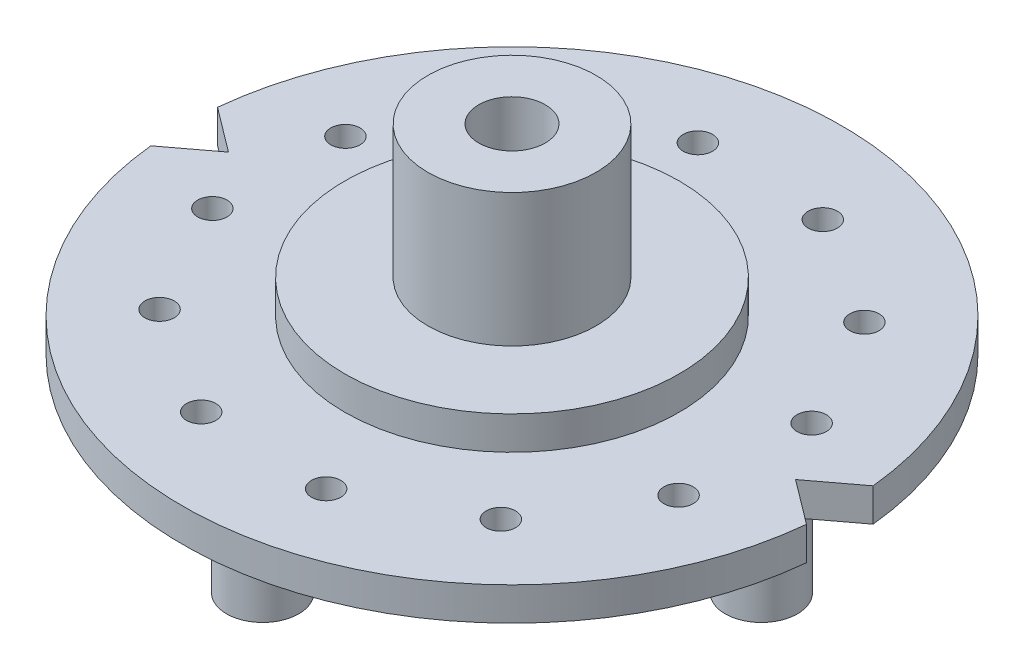
ISO-10303-21;
HEADER;
FILE_DESCRIPTION(('STEP AP214'),'2;1');
FILE_NAME('part.step','',(''),(''),'','','');
FILE_SCHEMA(('AUTOMOTIVE_DESIGN { 1 0 10303 214 1 1 1 1 }'));
ENDSEC;
DATA;
#1=APPLICATION_CONTEXT('core data for automotive mechanical design processes');
#2=APPLICATION_PROTOCOL_DEFINITION('international standard','automotive_design',2000,#1);
#3=PRODUCT_CONTEXT('',#1,'mechanical');
#4=PRODUCT('Part','Part','',(#3));
#5=PRODUCT_RELATED_PRODUCT_CATEGORY('part','',(#4));
#6=PRODUCT_DEFINITION_FORMATION('','',#4);
#7=PRODUCT_DEFINITION_CONTEXT('part definition',#1,'design');
#8=PRODUCT_DEFINITION('design','',#6,#7);
#9=PRODUCT_DEFINITION_SHAPE('','',#8);
#10=(LENGTH_UNIT() NAMED_UNIT(*) SI_UNIT(.MILLI.,.METRE.));
#11=(NAMED_UNIT(*) PLANE_ANGLE_UNIT() SI_UNIT($,.RADIAN.));
#12=(NAMED_UNIT(*) SI_UNIT($,.STERADIAN.) SOLID_ANGLE_UNIT());
#13=UNCERTAINTY_MEASURE_WITH_UNIT(LENGTH_MEASURE(1.E-05),#10,'distance_accuracy_value','');
#14=(GEOMETRIC_REPRESENTATION_CONTEXT(3) GLOBAL_UNCERTAINTY_ASSIGNED_CONTEXT((#13)) GLOBAL_UNIT_ASSIGNED_CONTEXT((#10,
#11,#12)) REPRESENTATION_CONTEXT('',''));
#15=CARTESIAN_POINT('',(0.,0.,0.));
#16=DIRECTION('',(0.,0.,1.));
#17=DIRECTION('',(1.,0.,0.));
#18=AXIS2_PLACEMENT_3D('',#15,#16,#17);
#19=CARTESIAN_POINT('',(0.,4.318,0.));
#20=DIRECTION('',(0.,-1.,0.));
#21=DIRECTION('',(0.,0.,-1.));
#22=AXIS2_PLACEMENT_3D('',#19,#20,#21);
#23=PLANE('',#22);
#24=CARTESIAN_POINT('',(0.,4.318,0.));
#25=DIRECTION('',(0.,1.,0.));
#26=DIRECTION('',(0.,0.,1.));
#27=AXIS2_PLACEMENT_3D('',#24,#25,#26);
#28=CIRCLE('',#27,21.717);
#29=CARTESIAN_POINT('',(0.,4.318,21.717));
#30=VERTEX_POINT('',#29);
#31=EDGE_CURVE('E220',#30,#30,#28,.T.);
#32=ORIENTED_EDGE('',*,*,#31,.F.);
#33=EDGE_LOOP('',(#32));
#34=FACE_BOUND('',#33,.T.);
#35=CARTESIAN_POINT('',(-31.0010557418068,4.318,-9.36604334248927));
#36=DIRECTION('',(0.,1.,0.));
#37=DIRECTION('',(0.,0.,1.));
#38=AXIS2_PLACEMENT_3D('',#35,#36,#37);
#39=CIRCLE('',#38,1.905);
#40=CARTESIAN_POINT('',(-31.0010557418068,4.318,-7.46104334248927));
#41=VERTEX_POINT('',#40);
#42=EDGE_CURVE('E159',#41,#41,#39,.T.);
#43=ORIENTED_EDGE('',*,*,#42,.F.);
#44=EDGE_LOOP('',(#43));
#45=FACE_BOUND('',#44,.T.);
#46=CARTESIAN_POINT('',(-31.530723487786,4.318,7.38929640336162));
#47=DIRECTION('',(0.,1.,0.));
#48=DIRECTION('',(0.,0.,1.));
#49=AXIS2_PLACEMENT_3D('',#46,#47,#48);
#50=CIRCLE('',#49,1.90499999999977);
#51=CARTESIAN_POINT('',(-31.530723487786,4.318,9.29429640336139));
#52=VERTEX_POINT('',#51);
#53=EDGE_CURVE('E137',#52,#52,#50,.T.);
#54=ORIENTED_EDGE('',*,*,#53,.F.);
#55=EDGE_LOOP('',(#54));
#56=FACE_BOUND('',#55,.T.);
#57=CARTESIAN_POINT('',(-23.6117593384439,4.318,22.1646801452972));
#58=DIRECTION('',(0.,1.,0.));
#59=DIRECTION('',(0.,0.,1.));
#60=AXIS2_PLACEMENT_3D('',#57,#58,#59);
#61=CIRCLE('',#60,1.90499999999961);
#62=CARTESIAN_POINT('',(-23.6117593384439,4.318,24.0696801452968));
#63=VERTEX_POINT('',#62);
#64=EDGE_CURVE('E148',#63,#63,#61,.T.);
#65=ORIENTED_EDGE('',*,*,#64,.F.);
#66=EDGE_LOOP('',(#65));
#67=FACE_BOUND('',#66,.T.);
#68=CARTESIAN_POINT('',(-9.36604334248754,4.318,31.0010557418059));
#69=DIRECTION('',(0.,1.,0.));
#70=DIRECTION('',(0.,0.,1.));
#71=AXIS2_PLACEMENT_3D('',#68,#69,#70);
#72=CIRCLE('',#71,1.90499999999981);
#73=CARTESIAN_POINT('',(-9.36604334248754,4.318,32.9060557418057));
#74=VERTEX_POINT('',#73);
#75=EDGE_CURVE('E142',#74,#74,#72,.T.);
#76=ORIENTED_EDGE('',*,*,#75,.F.);
#77=EDGE_LOOP('',(#76));
#78=FACE_BOUND('',#77,.T.);
#79=CARTESIAN_POINT('',(7.38929640336334,4.318,31.5307234877851));
#80=DIRECTION('',(0.,1.,0.));
#81=DIRECTION('',(0.,0.,1.));
#82=AXIS2_PLACEMENT_3D('',#79,#80,#81);
#83=CIRCLE('',#82,1.90500000000034);
#84=CARTESIAN_POINT('',(7.38929640336334,4.318,33.4357234877855));
#85=VERTEX_POINT('',#84);
#86=EDGE_CURVE('E141',#85,#85,#83,.T.);
#87=ORIENTED_EDGE('',*,*,#86,.F.);
#88=EDGE_LOOP('',(#87));
#89=FACE_BOUND('',#88,.T.);
#90=CARTESIAN_POINT('',(22.1646801452989,4.318,23.6117593384429));
#91=DIRECTION('',(0.,1.,0.));
#92=DIRECTION('',(0.,0.,1.));
#93=AXIS2_PLACEMENT_3D('',#90,#91,#92);
#94=CIRCLE('',#93,1.90500000000101);
#95=CARTESIAN_POINT('',(22.1646801452989,4.318,25.516759338444));
#96=VERTEX_POINT('',#95);
#97=EDGE_CURVE('E196',#96,#96,#94,.T.);
#98=ORIENTED_EDGE('',*,*,#97,.F.);
#99=EDGE_LOOP('',(#98));
#100=FACE_BOUND('',#99,.T.);
#101=CARTESIAN_POINT('',(31.0010557418076,4.318,9.36604334248662));
#102=DIRECTION('',(0.,1.,0.));
#103=DIRECTION('',(0.,0.,1.));
#104=AXIS2_PLACEMENT_3D('',#101,#102,#103);
#105=CIRCLE('',#104,1.90500000000166);
#106=CARTESIAN_POINT('',(31.0010557418076,4.318,11.2710433424883));
#107=VERTEX_POINT('',#106);
#108=EDGE_CURVE('E190',#107,#107,#105,.T.);
#109=ORIENTED_EDGE('',*,*,#108,.F.);
#110=EDGE_LOOP('',(#109));
#111=FACE_BOUND('',#110,.T.);
#112=CARTESIAN_POINT('',(31.5307234877869,4.318,-7.38929640336426));
#113=DIRECTION('',(0.,1.,0.));
#114=DIRECTION('',(0.,0.,1.));
#115=AXIS2_PLACEMENT_3D('',#112,#113,#114);
#116=CIRCLE('',#115,1.90500000000211);
#117=CARTESIAN_POINT('',(31.5307234877869,4.318,-5.48429640336215));
#118=VERTEX_POINT('',#117);
#119=EDGE_CURVE('E184',#118,#118,#116,.T.);
#120=ORIENTED_EDGE('',*,*,#119,.F.);
#121=EDGE_LOOP('',(#120));
#122=FACE_BOUND('',#121,.T.);
#123=CARTESIAN_POINT('',(23.6117593384447,4.318,-22.1646801452998));
#124=DIRECTION('',(0.,1.,0.));
#125=DIRECTION('',(0.,0.,1.));
#126=AXIS2_PLACEMENT_3D('',#123,#124,#125);
#127=CIRCLE('',#126,1.90500000000223);
#128=CARTESIAN_POINT('',(23.6117593384447,4.318,-20.2596801452976));
#129=VERTEX_POINT('',#128);
#130=EDGE_CURVE('E178',#129,#129,#127,.T.);
#131=ORIENTED_EDGE('',*,*,#130,.F.);
#132=EDGE_LOOP('',(#131));
#133=FACE_BOUND('',#132,.T.);
#134=CARTESIAN_POINT('',(9.36604334248835,4.318,-31.0010557418085));
#135=DIRECTION('',(0.,1.,0.));
#136=DIRECTION('',(0.,0.,1.));
#137=AXIS2_PLACEMENT_3D('',#134,#135,#136);
#138=CIRCLE('',#137,1.90500000000198);
#139=CARTESIAN_POINT('',(9.36604334248835,4.318,-29.0960557418065));
#140=VERTEX_POINT('',#139);
#141=EDGE_CURVE('E172',#140,#140,#138,.T.);
#142=ORIENTED_EDGE('',*,*,#141,.F.);
#143=EDGE_LOOP('',(#142));
#144=FACE_BOUND('',#143,.T.);
#145=CARTESIAN_POINT('',(-7.38929640336253,4.318,-31.5307234877878));
#146=DIRECTION('',(0.,1.,0.));
#147=DIRECTION('',(0.,0.,1.));
#148=AXIS2_PLACEMENT_3D('',#145,#146,#147);
#149=CIRCLE('',#148,1.90500000000143);
#150=CARTESIAN_POINT('',(-7.38929640336253,4.318,-29.6257234877863));
#151=VERTEX_POINT('',#150);
#152=EDGE_CURVE('E166',#151,#151,#149,.T.);
#153=ORIENTED_EDGE('',*,*,#152,.F.);
#154=EDGE_LOOP('',(#153));
#155=FACE_BOUND('',#154,.T.);
#156=CARTESIAN_POINT('',(-22.1646801452975,4.318,-23.6117593384453));
#157=DIRECTION('',(0.,1.,0.));
#158=DIRECTION('',(0.,0.,1.));
#159=AXIS2_PLACEMENT_3D('',#156,#157,#158);
#160=CIRCLE('',#159,1.905);
#161=CARTESIAN_POINT('',(-22.1646801452975,4.318,-21.7067593384453));
#162=VERTEX_POINT('',#161);
#163=EDGE_CURVE('E160',#162,#162,#160,.T.);
#164=ORIENTED_EDGE('',*,*,#163,.F.);
#165=EDGE_LOOP('',(#164));
#166=FACE_BOUND('',#165,.T.);
#167=CARTESIAN_POINT('',(0.,4.318,0.));
#168=DIRECTION('',(0.,1.,0.));
#169=DIRECTION('',(0.,0.,1.));
#170=AXIS2_PLACEMENT_3D('',#167,#168,#169);
#171=CIRCLE('',#170,42.799);
#172=CARTESIAN_POINT('',(-42.5791674941471,4.318,4.33230844993385));
#173=VERTEX_POINT('',#172);
#174=CARTESIAN_POINT('',(42.5791674941471,4.318,4.33230844993385));
#175=VERTEX_POINT('',#174);
#176=EDGE_CURVE('E216',#173,#175,#171,.T.);
#177=ORIENTED_EDGE('',*,*,#176,.T.);
#178=DIRECTION('',(-0.798635510047294,0.,-0.601815023152047));
#179=VECTOR('',#178,1.);
#180=CARTESIAN_POINT('',(13.3391380926299,4.318,-17.7016341307041));
#181=LINE('',#180,#179);
#182=CARTESIAN_POINT('',(36.83,4.318,0.));
#183=VERTEX_POINT('',#182);
#184=EDGE_CURVE('E134',#175,#183,#181,.T.);
#185=ORIENTED_EDGE('',*,*,#184,.T.);
#186=DIRECTION('',(0.798635510047294,0.,-0.601815023152047));
#187=VECTOR('',#186,1.);
#188=CARTESIAN_POINT('',(13.3391380926299,4.318,17.7016341307041));
#189=LINE('',#188,#187);
#190=CARTESIAN_POINT('',(42.5791674941471,4.318,-4.33230844993385));
#191=VERTEX_POINT('',#190);
#192=EDGE_CURVE('E131',#183,#191,#189,.T.);
#193=ORIENTED_EDGE('',*,*,#192,.T.);
#194=CARTESIAN_POINT('',(-42.5791674941471,4.318,-4.33230844993386));
#195=VERTEX_POINT('',#194);
#196=EDGE_CURVE('E219',#191,#195,#171,.T.);
#197=ORIENTED_EDGE('',*,*,#196,.T.);
#198=DIRECTION('',(-0.798635510047294,0.,-0.601815023152047));
#199=VECTOR('',#198,1.);
#200=CARTESIAN_POINT('',(-13.3391380926299,4.318,17.7016341307041));
#201=LINE('',#200,#199);
#202=CARTESIAN_POINT('',(-36.83,4.318,0.));
#203=VERTEX_POINT('',#202);
#204=EDGE_CURVE('E128',#203,#195,#201,.T.);
#205=ORIENTED_EDGE('',*,*,#204,.F.);
#206=DIRECTION('',(0.798635510047294,0.,-0.601815023152047));
#207=VECTOR('',#206,1.);
#208=CARTESIAN_POINT('',(-13.3391380926299,4.318,-17.7016341307041));
#209=LINE('',#208,#207);
#210=EDGE_CURVE('E102',#173,#203,#209,.T.);
#211=ORIENTED_EDGE('',*,*,#210,.F.);
#212=EDGE_LOOP('',(#177,#185,#193,#197,#205,#211));
#213=FACE_BOUND('',#212,.T.);
#214=ADVANCED_FACE('F35',(#34,#45,#56,#67,#78,#89,#100,#111,#122,#133,#144,#155,#166,#213),#23,.F.);
#215=CARTESIAN_POINT('',(0.,25.908,0.));
#216=DIRECTION('',(0.,1.,0.));
#217=DIRECTION('',(0.,0.,1.));
#218=AXIS2_PLACEMENT_3D('',#215,#216,#217);
#219=CYLINDRICAL_SURFACE('',#218,42.799);
#220=CARTESIAN_POINT('',(0.,0.,0.));
#221=DIRECTION('',(0.,1.,0.));
#222=DIRECTION('',(0.,0.,1.));
#223=AXIS2_PLACEMENT_3D('',#220,#221,#222);
#224=CIRCLE('',#223,42.799);
#225=CARTESIAN_POINT('',(-42.5791674941471,0.,4.33230844993385));
#226=VERTEX_POINT('',#225);
#227=CARTESIAN_POINT('',(42.5791674941471,0.,4.33230844993385));
#228=VERTEX_POINT('',#227);
#229=EDGE_CURVE('E212',#226,#228,#224,.T.);
#230=ORIENTED_EDGE('',*,*,#229,.T.);
#231=DIRECTION('',(0.,-1.,0.));
#232=VECTOR('',#231,1.);
#233=CARTESIAN_POINT('',(42.5791674941471,25.908,4.33230844993385));
#234=LINE('',#233,#232);
#235=EDGE_CURVE('E129',#175,#228,#234,.T.);
#236=ORIENTED_EDGE('',*,*,#235,.F.);
#237=ORIENTED_EDGE('',*,*,#176,.F.);
#238=DIRECTION('',(0.,-1.,0.));
#239=VECTOR('',#238,1.);
#240=CARTESIAN_POINT('',(-42.5791674941471,25.908,4.33230844993385));
#241=LINE('',#240,#239);
#242=EDGE_CURVE('E105',#173,#226,#241,.T.);
#243=ORIENTED_EDGE('',*,*,#242,.T.);
#244=EDGE_LOOP('',(#230,#236,#237,#243));
#245=FACE_BOUND('',#244,.T.);
#246=ADVANCED_FACE('F277',(#245),#219,.T.);
#247=ORIENTED_EDGE('',*,*,#196,.F.);
#248=DIRECTION('',(0.,-1.,0.));
#249=VECTOR('',#248,1.);
#250=CARTESIAN_POINT('',(42.5791674941471,25.908,-4.33230844993385));
#251=LINE('',#250,#249);
#252=CARTESIAN_POINT('',(42.5791674941471,0.,-4.33230844993385));
#253=VERTEX_POINT('',#252);
#254=EDGE_CURVE('E287',#191,#253,#251,.T.);
#255=ORIENTED_EDGE('',*,*,#254,.T.);
#256=CARTESIAN_POINT('',(-42.5791674941471,0.,-4.33230844993386));
#257=VERTEX_POINT('',#256);
#258=EDGE_CURVE('E215',#253,#257,#224,.T.);
#259=ORIENTED_EDGE('',*,*,#258,.T.);
#260=DIRECTION('',(0.,-1.,0.));
#261=VECTOR('',#260,1.);
#262=CARTESIAN_POINT('',(-42.5791674941471,25.908,-4.33230844993386));
#263=LINE('',#262,#261);
#264=EDGE_CURVE('E122',#195,#257,#263,.T.);
#265=ORIENTED_EDGE('',*,*,#264,.F.);
#266=EDGE_LOOP('',(#247,#255,#259,#265));
#267=FACE_BOUND('',#266,.T.);
#268=ADVANCED_FACE('F242',(#267),#219,.T.);
#269=CARTESIAN_POINT('',(0.,0.,0.));
#270=DIRECTION('',(0.,1.,0.));
#271=DIRECTION('',(0.,0.,1.));
#272=AXIS2_PLACEMENT_3D('',#269,#270,#271);
#273=PLANE('',#272);
#274=CARTESIAN_POINT('',(-32.3849999999991,0.,-9.20437059903634E-13));
#275=DIRECTION('',(0.,-1.,0.));
#276=DIRECTION('',(0.,0.,-1.));
#277=AXIS2_PLACEMENT_3D('',#274,#275,#276);
#278=CIRCLE('',#277,4.69900000000147);
#279=CARTESIAN_POINT('',(-37.0802155997854,0.,-0.188550978617197));
#280=VERTEX_POINT('',#279);
#281=CARTESIAN_POINT('',(-37.0802155997853,0.,0.188550978617127));
#282=VERTEX_POINT('',#281);
#283=EDGE_CURVE('E50',#280,#282,#278,.T.);
#284=ORIENTED_EDGE('',*,*,#283,.F.);
#285=DIRECTION('',(-0.798635510047294,0.,-0.601815023152047));
#286=VECTOR('',#285,1.);
#287=CARTESIAN_POINT('',(-13.3391380926299,0.,17.7016341307041));
#288=LINE('',#287,#286);
#289=EDGE_CURVE('E112',#280,#257,#288,.T.);
#290=ORIENTED_EDGE('',*,*,#289,.T.);
#291=ORIENTED_EDGE('',*,*,#258,.F.);
#292=DIRECTION('',(0.798635510047294,0.,-0.601815023152047));
#293=VECTOR('',#292,1.);
#294=CARTESIAN_POINT('',(13.3391380926299,0.,17.7016341307041));
#295=LINE('',#294,#293);
#296=CARTESIAN_POINT('',(37.0802155997864,0.,-0.188550978617912));
#297=VERTEX_POINT('',#296);
#298=EDGE_CURVE('E299',#297,#253,#295,.T.);
#299=ORIENTED_EDGE('',*,*,#298,.F.);
#300=CARTESIAN_POINT('',(32.3850000000009,0.,9.16471041244595E-13));
#301=DIRECTION('',(0.,-1.,0.));
#302=DIRECTION('',(0.,0.,-1.));
#303=AXIS2_PLACEMENT_3D('',#300,#301,#302);
#304=CIRCLE('',#303,4.69900000000072);
#305=CARTESIAN_POINT('',(37.0802155997864,0.,0.188550978617971));
#306=VERTEX_POINT('',#305);
#307=EDGE_CURVE('E312',#306,#297,#304,.T.);
#308=ORIENTED_EDGE('',*,*,#307,.F.);
#309=DIRECTION('',(-0.798635510047294,0.,-0.601815023152047));
#310=VECTOR('',#309,1.);
#311=CARTESIAN_POINT('',(13.3391380926299,0.,-17.7016341307041));
#312=LINE('',#311,#310);
#313=EDGE_CURVE('E124',#228,#306,#312,.T.);
#314=ORIENTED_EDGE('',*,*,#313,.F.);
#315=ORIENTED_EDGE('',*,*,#229,.F.);
#316=DIRECTION('',(0.798635510047294,0.,-0.601815023152047));
#317=VECTOR('',#316,1.);
#318=CARTESIAN_POINT('',(-13.3391380926299,0.,-17.7016341307041));
#319=LINE('',#318,#317);
#320=EDGE_CURVE('E106',#226,#282,#319,.T.);
#321=ORIENTED_EDGE('',*,*,#320,.T.);
#322=EDGE_LOOP('',(#284,#290,#291,#299,#308,#314,#315,#321));
#323=FACE_BOUND('',#322,.T.);
#324=CARTESIAN_POINT('',(1.83294208248919E-12,0.,-32.385));
#325=DIRECTION('',(0.,1.,0.));
#326=DIRECTION('',(0.,0.,1.));
#327=AXIS2_PLACEMENT_3D('',#324,#325,#326);
#328=CIRCLE('',#327,4.69900000000197);
#329=CARTESIAN_POINT('',(1.83294208248919E-12,0.,-27.685999999998));
#330=VERTEX_POINT('',#329);
#331=EDGE_CURVE('E11',#330,#330,#328,.F.);
#332=ORIENTED_EDGE('',*,*,#331,.F.);
#333=EDGE_LOOP('',(#332));
#334=FACE_BOUND('',#333,.T.);
#335=CARTESIAN_POINT('',(0.,0.,32.385));
#336=DIRECTION('',(0.,1.,0.));
#337=DIRECTION('',(0.,0.,1.));
#338=AXIS2_PLACEMENT_3D('',#335,#336,#337);
#339=CIRCLE('',#338,4.699);
#340=CARTESIAN_POINT('',(0.,0.,37.084));
#341=VERTEX_POINT('',#340);
#342=EDGE_CURVE('E43',#341,#341,#339,.F.);
#343=ORIENTED_EDGE('',*,*,#342,.F.);
#344=EDGE_LOOP('',(#343));
#345=FACE_BOUND('',#344,.T.);
#346=CARTESIAN_POINT('',(-31.0010557418068,0.,-9.36604334248927));
#347=DIRECTION('',(0.,1.,0.));
#348=DIRECTION('',(0.,0.,1.));
#349=AXIS2_PLACEMENT_3D('',#346,#347,#348);
#350=CIRCLE('',#349,1.905);
#351=CARTESIAN_POINT('',(-31.0010557418068,0.,-7.46104334248927));
#352=VERTEX_POINT('',#351);
#353=EDGE_CURVE('E204',#352,#352,#350,.T.);
#354=ORIENTED_EDGE('',*,*,#353,.T.);
#355=EDGE_LOOP('',(#354));
#356=FACE_BOUND('',#355,.T.);
#357=CARTESIAN_POINT('',(-31.530723487786,0.,7.38929640336162));
#358=DIRECTION('',(0.,1.,0.));
#359=DIRECTION('',(0.,0.,1.));
#360=AXIS2_PLACEMENT_3D('',#357,#358,#359);
#361=CIRCLE('',#360,1.90499999999977);
#362=CARTESIAN_POINT('',(-31.530723487786,0.,9.29429640336139));
#363=VERTEX_POINT('',#362);
#364=EDGE_CURVE('E151',#363,#363,#361,.T.);
#365=ORIENTED_EDGE('',*,*,#364,.T.);
#366=EDGE_LOOP('',(#365));
#367=FACE_BOUND('',#366,.T.);
#368=CARTESIAN_POINT('',(-23.6117593384439,0.,22.1646801452972));
#369=DIRECTION('',(0.,1.,0.));
#370=DIRECTION('',(0.,0.,1.));
#371=AXIS2_PLACEMENT_3D('',#368,#369,#370);
#372=CIRCLE('',#371,1.90499999999961);
#373=CARTESIAN_POINT('',(-23.6117593384439,0.,24.0696801452968));
#374=VERTEX_POINT('',#373);
#375=EDGE_CURVE('E145',#374,#374,#372,.T.);
#376=ORIENTED_EDGE('',*,*,#375,.T.);
#377=EDGE_LOOP('',(#376));
#378=FACE_BOUND('',#377,.T.);
#379=CARTESIAN_POINT('',(-9.36604334248754,0.,31.0010557418059));
#380=DIRECTION('',(0.,1.,0.));
#381=DIRECTION('',(0.,0.,1.));
#382=AXIS2_PLACEMENT_3D('',#379,#380,#381);
#383=CIRCLE('',#382,1.90499999999981);
#384=CARTESIAN_POINT('',(-9.36604334248754,0.,32.9060557418057));
#385=VERTEX_POINT('',#384);
#386=EDGE_CURVE('E138',#385,#385,#383,.T.);
#387=ORIENTED_EDGE('',*,*,#386,.T.);
#388=EDGE_LOOP('',(#387));
#389=FACE_BOUND('',#388,.T.);
#390=CARTESIAN_POINT('',(7.38929640336334,0.,31.5307234877851));
#391=DIRECTION('',(0.,1.,0.));
#392=DIRECTION('',(0.,0.,1.));
#393=AXIS2_PLACEMENT_3D('',#390,#391,#392);
#394=CIRCLE('',#393,1.90500000000034);
#395=CARTESIAN_POINT('',(7.38929640336334,0.,33.4357234877855));
#396=VERTEX_POINT('',#395);
#397=EDGE_CURVE('E199',#396,#396,#394,.T.);
#398=ORIENTED_EDGE('',*,*,#397,.T.);
#399=EDGE_LOOP('',(#398));
#400=FACE_BOUND('',#399,.T.);
#401=CARTESIAN_POINT('',(22.1646801452989,0.,23.6117593384429));
#402=DIRECTION('',(0.,1.,0.));
#403=DIRECTION('',(0.,0.,1.));
#404=AXIS2_PLACEMENT_3D('',#401,#402,#403);
#405=CIRCLE('',#404,1.90500000000101);
#406=CARTESIAN_POINT('',(22.1646801452989,0.,25.516759338444));
#407=VERTEX_POINT('',#406);
#408=EDGE_CURVE('E193',#407,#407,#405,.T.);
#409=ORIENTED_EDGE('',*,*,#408,.T.);
#410=EDGE_LOOP('',(#409));
#411=FACE_BOUND('',#410,.T.);
#412=CARTESIAN_POINT('',(31.0010557418076,0.,9.36604334248662));
#413=DIRECTION('',(0.,1.,0.));
#414=DIRECTION('',(0.,0.,1.));
#415=AXIS2_PLACEMENT_3D('',#412,#413,#414);
#416=CIRCLE('',#415,1.90500000000166);
#417=CARTESIAN_POINT('',(31.0010557418076,0.,11.2710433424883));
#418=VERTEX_POINT('',#417);
#419=EDGE_CURVE('E187',#418,#418,#416,.T.);
#420=ORIENTED_EDGE('',*,*,#419,.T.);
#421=EDGE_LOOP('',(#420));
#422=FACE_BOUND('',#421,.T.);
#423=CARTESIAN_POINT('',(31.5307234877869,0.,-7.38929640336426));
#424=DIRECTION('',(0.,1.,0.));
#425=DIRECTION('',(0.,0.,1.));
#426=AXIS2_PLACEMENT_3D('',#423,#424,#425);
#427=CIRCLE('',#426,1.90500000000211);
#428=CARTESIAN_POINT('',(31.5307234877869,0.,-5.48429640336215));
#429=VERTEX_POINT('',#428);
#430=EDGE_CURVE('E181',#429,#429,#427,.T.);
#431=ORIENTED_EDGE('',*,*,#430,.T.);
#432=EDGE_LOOP('',(#431));
#433=FACE_BOUND('',#432,.T.);
#434=CARTESIAN_POINT('',(23.6117593384447,0.,-22.1646801452998));
#435=DIRECTION('',(0.,1.,0.));
#436=DIRECTION('',(0.,0.,1.));
#437=AXIS2_PLACEMENT_3D('',#434,#435,#436);
#438=CIRCLE('',#437,1.90500000000223);
#439=CARTESIAN_POINT('',(23.6117593384447,0.,-20.2596801452976));
#440=VERTEX_POINT('',#439);
#441=EDGE_CURVE('E175',#440,#440,#438,.T.);
#442=ORIENTED_EDGE('',*,*,#441,.T.);
#443=EDGE_LOOP('',(#442));
#444=FACE_BOUND('',#443,.T.);
#445=CARTESIAN_POINT('',(9.36604334248835,0.,-31.0010557418085));
#446=DIRECTION('',(0.,1.,0.));
#447=DIRECTION('',(0.,0.,1.));
#448=AXIS2_PLACEMENT_3D('',#445,#446,#447);
#449=CIRCLE('',#448,1.90500000000198);
#450=CARTESIAN_POINT('',(9.36604334248835,0.,-29.0960557418065));
#451=VERTEX_POINT('',#450);
#452=EDGE_CURVE('E169',#451,#451,#449,.T.);
#453=ORIENTED_EDGE('',*,*,#452,.T.);
#454=EDGE_LOOP('',(#453));
#455=FACE_BOUND('',#454,.T.);
#456=CARTESIAN_POINT('',(-7.38929640336253,0.,-31.5307234877878));
#457=DIRECTION('',(0.,1.,0.));
#458=DIRECTION('',(0.,0.,1.));
#459=AXIS2_PLACEMENT_3D('',#456,#457,#458);
#460=CIRCLE('',#459,1.90500000000143);
#461=CARTESIAN_POINT('',(-7.38929640336253,0.,-29.6257234877863));
#462=VERTEX_POINT('',#461);
#463=EDGE_CURVE('E163',#462,#462,#460,.T.);
#464=ORIENTED_EDGE('',*,*,#463,.T.);
#465=EDGE_LOOP('',(#464));
#466=FACE_BOUND('',#465,.T.);
#467=CARTESIAN_POINT('',(-22.1646801452975,0.,-23.6117593384453));
#468=DIRECTION('',(0.,1.,0.));
#469=DIRECTION('',(0.,0.,1.));
#470=AXIS2_PLACEMENT_3D('',#467,#468,#469);
#471=CIRCLE('',#470,1.905);
#472=CARTESIAN_POINT('',(-22.1646801452975,0.,-21.7067593384453));
#473=VERTEX_POINT('',#472);
#474=EDGE_CURVE('E156',#473,#473,#471,.T.);
#475=ORIENTED_EDGE('',*,*,#474,.T.);
#476=EDGE_LOOP('',(#475));
#477=FACE_BOUND('',#476,.T.);
#478=ADVANCED_FACE('F239',(#323,#334,#345,#356,#367,#378,#389,#400,#411,#422,#433,#444,#455,
#466,#477),#273,.F.);
#479=CARTESIAN_POINT('',(0.,25.908,0.));
#480=DIRECTION('',(0.,1.,0.));
#481=DIRECTION('',(0.,0.,1.));
#482=AXIS2_PLACEMENT_3D('',#479,#480,#481);
#483=CYLINDRICAL_SURFACE('',#482,4.318);
#484=CARTESIAN_POINT('',(0.,4.572,0.));
#485=DIRECTION('',(0.,1.,0.));
#486=DIRECTION('',(0.,0.,1.));
#487=AXIS2_PLACEMENT_3D('',#484,#485,#486);
#488=CIRCLE('',#487,4.318);
#489=CARTESIAN_POINT('',(0.,4.572,4.318));
#490=VERTEX_POINT('',#489);
#491=EDGE_CURVE('E207',#490,#490,#488,.T.);
#492=ORIENTED_EDGE('',*,*,#491,.F.);
#493=EDGE_LOOP('',(#492));
#494=FACE_BOUND('',#493,.T.);
#495=CARTESIAN_POINT('',(0.,25.908,0.));
#496=DIRECTION('',(0.,1.,0.));
#497=DIRECTION('',(0.,0.,1.));
#498=AXIS2_PLACEMENT_3D('',#495,#496,#497);
#499=CIRCLE('',#498,4.318);
#500=CARTESIAN_POINT('',(0.,25.908,4.318));
#501=VERTEX_POINT('',#500);
#502=EDGE_CURVE('E232',#501,#501,#499,.T.);
#503=ORIENTED_EDGE('',*,*,#502,.T.);
#504=EDGE_LOOP('',(#503));
#505=FACE_BOUND('',#504,.T.);
#506=ADVANCED_FACE('F37',(#494,#505),#483,.F.);
#507=CARTESIAN_POINT('',(0.,25.908,0.));
#508=DIRECTION('',(0.,-1.,0.));
#509=DIRECTION('',(0.,0.,-1.));
#510=AXIS2_PLACEMENT_3D('',#507,#508,#509);
#511=PLANE('',#510);
#512=ORIENTED_EDGE('',*,*,#502,.F.);
#513=EDGE_LOOP('',(#512));
#514=FACE_BOUND('',#513,.T.);
#515=CARTESIAN_POINT('',(0.,25.908,0.));
#516=DIRECTION('',(0.,1.,0.));
#517=DIRECTION('',(0.,0.,1.));
#518=AXIS2_PLACEMENT_3D('',#515,#516,#517);
#519=CIRCLE('',#518,10.922);
#520=CARTESIAN_POINT('',(0.,25.908,10.922));
#521=VERTEX_POINT('',#520);
#522=EDGE_CURVE('E229',#521,#521,#519,.T.);
#523=ORIENTED_EDGE('',*,*,#522,.T.);
#524=EDGE_LOOP('',(#523));
#525=FACE_BOUND('',#524,.T.);
#526=ADVANCED_FACE('F431',(#514,#525),#511,.F.);
#527=CARTESIAN_POINT('',(0.,25.908,0.));
#528=DIRECTION('',(0.,1.,0.));
#529=DIRECTION('',(0.,0.,1.));
#530=AXIS2_PLACEMENT_3D('',#527,#528,#529);
#531=CYLINDRICAL_SURFACE('',#530,10.922);
#532=ORIENTED_EDGE('',*,*,#522,.F.);
#533=EDGE_LOOP('',(#532));
#534=FACE_BOUND('',#533,.T.);
#535=CARTESIAN_POINT('',(0.,8.63599999999999,0.));
#536=DIRECTION('',(0.,1.,0.));
#537=DIRECTION('',(0.,0.,1.));
#538=AXIS2_PLACEMENT_3D('',#535,#536,#537);
#539=CIRCLE('',#538,10.922);
#540=CARTESIAN_POINT('',(0.,8.63599999999999,10.922));
#541=VERTEX_POINT('',#540);
#542=EDGE_CURVE('E226',#541,#541,#539,.T.);
#543=ORIENTED_EDGE('',*,*,#542,.T.);
#544=EDGE_LOOP('',(#543));
#545=FACE_BOUND('',#544,.T.);
#546=ADVANCED_FACE('F428',(#534,#545),#531,.T.);
#547=CARTESIAN_POINT('',(0.,8.63599999999999,0.));
#548=DIRECTION('',(0.,-1.,0.));
#549=DIRECTION('',(0.,0.,-1.));
#550=AXIS2_PLACEMENT_3D('',#547,#548,#549);
#551=PLANE('',#550);
#552=ORIENTED_EDGE('',*,*,#542,.F.);
#553=EDGE_LOOP('',(#552));
#554=FACE_BOUND('',#553,.T.);
#555=CARTESIAN_POINT('',(0.,8.63599999999999,0.));
#556=DIRECTION('',(0.,1.,0.));
#557=DIRECTION('',(0.,0.,1.));
#558=AXIS2_PLACEMENT_3D('',#555,#556,#557);
#559=CIRCLE('',#558,21.717);
#560=CARTESIAN_POINT('',(0.,8.63599999999999,21.717));
#561=VERTEX_POINT('',#560);
#562=EDGE_CURVE('E223',#561,#561,#559,.T.);
#563=ORIENTED_EDGE('',*,*,#562,.T.);
#564=EDGE_LOOP('',(#563));
#565=FACE_BOUND('',#564,.T.);
#566=ADVANCED_FACE('F424',(#554,#565),#551,.F.);
#567=CARTESIAN_POINT('',(0.,25.908,0.));
#568=DIRECTION('',(0.,1.,0.));
#569=DIRECTION('',(0.,0.,1.));
#570=AXIS2_PLACEMENT_3D('',#567,#568,#569);
#571=CYLINDRICAL_SURFACE('',#570,21.717);
#572=ORIENTED_EDGE('',*,*,#562,.F.);
#573=EDGE_LOOP('',(#572));
#574=FACE_BOUND('',#573,.T.);
#575=ORIENTED_EDGE('',*,*,#31,.T.);
#576=EDGE_LOOP('',(#575));
#577=FACE_BOUND('',#576,.T.);
#578=ADVANCED_FACE('F417',(#574,#577),#571,.T.);
#579=CARTESIAN_POINT('',(0.,4.572,0.));
#580=DIRECTION('',(0.,1.,0.));
#581=DIRECTION('',(0.,0.,1.));
#582=AXIS2_PLACEMENT_3D('',#579,#580,#581);
#583=PLANE('',#582);
#584=ORIENTED_EDGE('',*,*,#491,.T.);
#585=EDGE_LOOP('',(#584));
#586=FACE_BOUND('',#585,.T.);
#587=ADVANCED_FACE('F414',(#586),#583,.T.);
#588=CARTESIAN_POINT('',(-31.0010557418068,0.,-9.36604334248927));
#589=DIRECTION('',(0.,1.,0.));
#590=DIRECTION('',(0.,0.,1.));
#591=AXIS2_PLACEMENT_3D('',#588,#589,#590);
#592=CYLINDRICAL_SURFACE('',#591,1.905);
#593=ORIENTED_EDGE('',*,*,#353,.F.);
#594=EDGE_LOOP('',(#593));
#595=FACE_BOUND('',#594,.T.);
#596=ORIENTED_EDGE('',*,*,#42,.T.);
#597=EDGE_LOOP('',(#596));
#598=FACE_BOUND('',#597,.T.);
#599=ADVANCED_FACE('F383',(#595,#598),#592,.F.);
#600=CARTESIAN_POINT('',(-31.530723487786,0.,7.38929640336162));
#601=DIRECTION('',(0.,1.,0.));
#602=DIRECTION('',(0.,0.,1.));
#603=AXIS2_PLACEMENT_3D('',#600,#601,#602);
#604=CYLINDRICAL_SURFACE('',#603,1.90499999999977);
#605=ORIENTED_EDGE('',*,*,#364,.F.);
#606=EDGE_LOOP('',(#605));
#607=FACE_BOUND('',#606,.T.);
#608=ORIENTED_EDGE('',*,*,#53,.T.);
#609=EDGE_LOOP('',(#608));
#610=FACE_BOUND('',#609,.T.);
#611=ADVANCED_FACE('F380',(#607,#610),#604,.F.);
#612=CARTESIAN_POINT('',(-23.6117593384439,0.,22.1646801452972));
#613=DIRECTION('',(0.,1.,0.));
#614=DIRECTION('',(0.,0.,1.));
#615=AXIS2_PLACEMENT_3D('',#612,#613,#614);
#616=CYLINDRICAL_SURFACE('',#615,1.90499999999961);
#617=ORIENTED_EDGE('',*,*,#375,.F.);
#618=EDGE_LOOP('',(#617));
#619=FACE_BOUND('',#618,.T.);
#620=ORIENTED_EDGE('',*,*,#64,.T.);
#621=EDGE_LOOP('',(#620));
#622=FACE_BOUND('',#621,.T.);
#623=ADVANCED_FACE('F376',(#619,#622),#616,.F.);
#624=CARTESIAN_POINT('',(-9.36604334248754,0.,31.0010557418059));
#625=DIRECTION('',(0.,1.,0.));
#626=DIRECTION('',(0.,0.,1.));
#627=AXIS2_PLACEMENT_3D('',#624,#625,#626);
#628=CYLINDRICAL_SURFACE('',#627,1.90499999999981);
#629=ORIENTED_EDGE('',*,*,#386,.F.);
#630=EDGE_LOOP('',(#629));
#631=FACE_BOUND('',#630,.T.);
#632=ORIENTED_EDGE('',*,*,#75,.T.);
#633=EDGE_LOOP('',(#632));
#634=FACE_BOUND('',#633,.T.);
#635=ADVANCED_FACE('F372',(#631,#634),#628,.F.);
#636=CARTESIAN_POINT('',(7.38929640336334,0.,31.5307234877851));
#637=DIRECTION('',(0.,1.,0.));
#638=DIRECTION('',(0.,0.,1.));
#639=AXIS2_PLACEMENT_3D('',#636,#637,#638);
#640=CYLINDRICAL_SURFACE('',#639,1.90500000000034);
#641=ORIENTED_EDGE('',*,*,#397,.F.);
#642=EDGE_LOOP('',(#641));
#643=FACE_BOUND('',#642,.T.);
#644=ORIENTED_EDGE('',*,*,#86,.T.);
#645=EDGE_LOOP('',(#644));
#646=FACE_BOUND('',#645,.T.);
#647=ADVANCED_FACE('F375',(#643,#646),#640,.F.);
#648=CARTESIAN_POINT('',(22.1646801452989,0.,23.6117593384429));
#649=DIRECTION('',(0.,1.,0.));
#650=DIRECTION('',(0.,0.,1.));
#651=AXIS2_PLACEMENT_3D('',#648,#649,#650);
#652=CYLINDRICAL_SURFACE('',#651,1.90500000000101);
#653=ORIENTED_EDGE('',*,*,#408,.F.);
#654=EDGE_LOOP('',(#653));
#655=FACE_BOUND('',#654,.T.);
#656=ORIENTED_EDGE('',*,*,#97,.T.);
#657=EDGE_LOOP('',(#656));
#658=FACE_BOUND('',#657,.T.);
#659=ADVANCED_FACE('F404',(#655,#658),#652,.F.);
#660=CARTESIAN_POINT('',(31.0010557418076,0.,9.36604334248662));
#661=DIRECTION('',(0.,1.,0.));
#662=DIRECTION('',(0.,0.,1.));
#663=AXIS2_PLACEMENT_3D('',#660,#661,#662);
#664=CYLINDRICAL_SURFACE('',#663,1.90500000000166);
#665=ORIENTED_EDGE('',*,*,#419,.F.);
#666=EDGE_LOOP('',(#665));
#667=FACE_BOUND('',#666,.T.);
#668=ORIENTED_EDGE('',*,*,#108,.T.);
#669=EDGE_LOOP('',(#668));
#670=FACE_BOUND('',#669,.T.);
#671=ADVANCED_FACE('F400',(#667,#670),#664,.F.);
#672=CARTESIAN_POINT('',(31.5307234877869,0.,-7.38929640336426));
#673=DIRECTION('',(0.,1.,0.));
#674=DIRECTION('',(0.,0.,1.));
#675=AXIS2_PLACEMENT_3D('',#672,#673,#674);
#676=CYLINDRICAL_SURFACE('',#675,1.90500000000211);
#677=ORIENTED_EDGE('',*,*,#430,.F.);
#678=EDGE_LOOP('',(#677));
#679=FACE_BOUND('',#678,.T.);
#680=ORIENTED_EDGE('',*,*,#119,.T.);
#681=EDGE_LOOP('',(#680));
#682=FACE_BOUND('',#681,.T.);
#683=ADVANCED_FACE('F396',(#679,#682),#676,.F.);
#684=CARTESIAN_POINT('',(23.6117593384447,0.,-22.1646801452998));
#685=DIRECTION('',(0.,1.,0.));
#686=DIRECTION('',(0.,0.,1.));
#687=AXIS2_PLACEMENT_3D('',#684,#685,#686);
#688=CYLINDRICAL_SURFACE('',#687,1.90500000000223);
#689=ORIENTED_EDGE('',*,*,#441,.F.);
#690=EDGE_LOOP('',(#689));
#691=FACE_BOUND('',#690,.T.);
#692=ORIENTED_EDGE('',*,*,#130,.T.);
#693=EDGE_LOOP('',(#692));
#694=FACE_BOUND('',#693,.T.);
#695=ADVANCED_FACE('F392',(#691,#694),#688,.F.);
#696=CARTESIAN_POINT('',(9.36604334248835,0.,-31.0010557418085));
#697=DIRECTION('',(0.,1.,0.));
#698=DIRECTION('',(0.,0.,1.));
#699=AXIS2_PLACEMENT_3D('',#696,#697,#698);
#700=CYLINDRICAL_SURFACE('',#699,1.90500000000198);
#701=ORIENTED_EDGE('',*,*,#452,.F.);
#702=EDGE_LOOP('',(#701));
#703=FACE_BOUND('',#702,.T.);
#704=ORIENTED_EDGE('',*,*,#141,.T.);
#705=EDGE_LOOP('',(#704));
#706=FACE_BOUND('',#705,.T.);
#707=ADVANCED_FACE('F388',(#703,#706),#700,.F.);
#708=CARTESIAN_POINT('',(-7.38929640336253,0.,-31.5307234877878));
#709=DIRECTION('',(0.,1.,0.));
#710=DIRECTION('',(0.,0.,1.));
#711=AXIS2_PLACEMENT_3D('',#708,#709,#710);
#712=CYLINDRICAL_SURFACE('',#711,1.90500000000143);
#713=ORIENTED_EDGE('',*,*,#463,.F.);
#714=EDGE_LOOP('',(#713));
#715=FACE_BOUND('',#714,.T.);
#716=ORIENTED_EDGE('',*,*,#152,.T.);
#717=EDGE_LOOP('',(#716));
#718=FACE_BOUND('',#717,.T.);
#719=ADVANCED_FACE('F271',(#715,#718),#712,.F.);
#720=CARTESIAN_POINT('',(-22.1646801452975,0.,-23.6117593384453));
#721=DIRECTION('',(0.,1.,0.));
#722=DIRECTION('',(0.,0.,1.));
#723=AXIS2_PLACEMENT_3D('',#720,#721,#722);
#724=CYLINDRICAL_SURFACE('',#723,1.905);
#725=ORIENTED_EDGE('',*,*,#474,.F.);
#726=EDGE_LOOP('',(#725));
#727=FACE_BOUND('',#726,.T.);
#728=ORIENTED_EDGE('',*,*,#163,.T.);
#729=EDGE_LOOP('',(#728));
#730=FACE_BOUND('',#729,.T.);
#731=ADVANCED_FACE('F268',(#727,#730),#724,.F.);
#732=CARTESIAN_POINT('',(-13.3391380926299,25.908,17.7016341307041));
#733=DIRECTION('',(-0.601815023152047,0.,0.798635510047294));
#734=DIRECTION('',(0.798635510047294,0.,0.601815023152047));
#735=AXIS2_PLACEMENT_3D('',#732,#733,#734);
#736=PLANE('',#735);
#737=ORIENTED_EDGE('',*,*,#204,.T.);
#738=ORIENTED_EDGE('',*,*,#264,.T.);
#739=ORIENTED_EDGE('',*,*,#289,.F.);
#740=CARTESIAN_POINT('',(-36.83,0.,0.));
#741=VERTEX_POINT('',#740);
#742=EDGE_CURVE('E109',#741,#280,#288,.T.);
#743=ORIENTED_EDGE('',*,*,#742,.F.);
#744=DIRECTION('',(0.,-1.,0.));
#745=VECTOR('',#744,1.);
#746=CARTESIAN_POINT('',(-36.83,25.908,0.));
#747=LINE('',#746,#745);
#748=EDGE_CURVE('E98',#203,#741,#747,.T.);
#749=ORIENTED_EDGE('',*,*,#748,.F.);
#750=EDGE_LOOP('',(#737,#738,#739,#743,#749));
#751=FACE_BOUND('',#750,.T.);
#752=ADVANCED_FACE('F110',(#751),#736,.T.);
#753=CARTESIAN_POINT('',(-13.3391380926299,25.908,-17.7016341307041));
#754=DIRECTION('',(-0.601815023152047,0.,-0.798635510047294));
#755=DIRECTION('',(-0.798635510047294,0.,0.601815023152047));
#756=AXIS2_PLACEMENT_3D('',#753,#754,#755);
#757=PLANE('',#756);
#758=ORIENTED_EDGE('',*,*,#210,.T.);
#759=ORIENTED_EDGE('',*,*,#748,.T.);
#760=EDGE_CURVE('E58',#282,#741,#319,.T.);
#761=ORIENTED_EDGE('',*,*,#760,.F.);
#762=ORIENTED_EDGE('',*,*,#320,.F.);
#763=ORIENTED_EDGE('',*,*,#242,.F.);
#764=EDGE_LOOP('',(#758,#759,#761,#762,#763));
#765=FACE_BOUND('',#764,.T.);
#766=ADVANCED_FACE('F100',(#765),#757,.T.);
#767=CARTESIAN_POINT('',(13.3391380926299,25.908,-17.7016341307041));
#768=DIRECTION('',(-0.601815023152047,0.,0.798635510047294));
#769=DIRECTION('',(0.798635510047294,0.,0.601815023152047));
#770=AXIS2_PLACEMENT_3D('',#767,#768,#769);
#771=PLANE('',#770);
#772=ORIENTED_EDGE('',*,*,#235,.T.);
#773=ORIENTED_EDGE('',*,*,#313,.T.);
#774=DIRECTION('',(0.798635510047294,0.,0.601815023152047));
#775=VECTOR('',#774,1.);
#776=CARTESIAN_POINT('',(13.3391380926299,0.,-17.7016341307041));
#777=LINE('',#776,#775);
#778=CARTESIAN_POINT('',(36.83,0.,0.));
#779=VERTEX_POINT('',#778);
#780=EDGE_CURVE('E306',#779,#306,#777,.T.);
#781=ORIENTED_EDGE('',*,*,#780,.F.);
#782=DIRECTION('',(0.,-1.,0.));
#783=VECTOR('',#782,1.);
#784=CARTESIAN_POINT('',(36.83,25.908,0.));
#785=LINE('',#784,#783);
#786=EDGE_CURVE('E290',#183,#779,#785,.T.);
#787=ORIENTED_EDGE('',*,*,#786,.F.);
#788=ORIENTED_EDGE('',*,*,#184,.F.);
#789=EDGE_LOOP('',(#772,#773,#781,#787,#788));
#790=FACE_BOUND('',#789,.T.);
#791=ADVANCED_FACE('F365',(#790),#771,.F.);
#792=CARTESIAN_POINT('',(13.3391380926299,25.908,17.7016341307041));
#793=DIRECTION('',(-0.601815023152047,0.,-0.798635510047294));
#794=DIRECTION('',(-0.798635510047294,0.,0.601815023152047));
#795=AXIS2_PLACEMENT_3D('',#792,#793,#794);
#796=PLANE('',#795);
#797=ORIENTED_EDGE('',*,*,#786,.T.);
#798=EDGE_CURVE('E293',#779,#297,#295,.T.);
#799=ORIENTED_EDGE('',*,*,#798,.T.);
#800=ORIENTED_EDGE('',*,*,#298,.T.);
#801=ORIENTED_EDGE('',*,*,#254,.F.);
#802=ORIENTED_EDGE('',*,*,#192,.F.);
#803=EDGE_LOOP('',(#797,#799,#800,#801,#802));
#804=FACE_BOUND('',#803,.T.);
#805=ADVANCED_FACE('F361',(#804),#796,.F.);
#806=CARTESIAN_POINT('',(0.,-10.668,32.385));
#807=DIRECTION('',(0.,1.,0.));
#808=DIRECTION('',(0.,0.,1.));
#809=AXIS2_PLACEMENT_3D('',#806,#807,#808);
#810=CYLINDRICAL_SURFACE('',#809,4.699);
#811=CARTESIAN_POINT('',(0.,-10.668,32.385));
#812=DIRECTION('',(0.,-1.,0.));
#813=DIRECTION('',(0.,0.,-1.));
#814=AXIS2_PLACEMENT_3D('',#811,#812,#813);
#815=CIRCLE('',#814,4.699);
#816=CARTESIAN_POINT('',(0.,-10.668,27.686));
#817=VERTEX_POINT('',#816);
#818=EDGE_CURVE('E303',#817,#817,#815,.T.);
#819=ORIENTED_EDGE('',*,*,#818,.F.);
#820=EDGE_LOOP('',(#819));
#821=FACE_BOUND('',#820,.T.);
#822=ORIENTED_EDGE('',*,*,#342,.T.);
#823=EDGE_LOOP('',(#822));
#824=FACE_BOUND('',#823,.T.);
#825=ADVANCED_FACE('F237',(#821,#824),#810,.T.);
#826=CARTESIAN_POINT('',(0.,-10.668,32.385));
#827=DIRECTION('',(0.,-1.,0.));
#828=DIRECTION('',(0.,0.,-1.));
#829=AXIS2_PLACEMENT_3D('',#826,#827,#828);
#830=PLANE('',#829);
#831=ORIENTED_EDGE('',*,*,#818,.T.);
#832=EDGE_LOOP('',(#831));
#833=FACE_BOUND('',#832,.T.);
#834=ADVANCED_FACE('F351',(#833),#830,.T.);
#835=CARTESIAN_POINT('',(32.3850000000009,0.,9.16471041244595E-13));
#836=DIRECTION('',(0.,-1.,0.));
#837=DIRECTION('',(0.,0.,-1.));
#838=AXIS2_PLACEMENT_3D('',#835,#836,#837);
#839=PLANE('',#838);
#840=ORIENTED_EDGE('',*,*,#798,.F.);
#841=ORIENTED_EDGE('',*,*,#780,.T.);
#842=EDGE_CURVE('E309',#297,#306,#304,.T.);
#843=ORIENTED_EDGE('',*,*,#842,.F.);
#844=EDGE_LOOP('',(#840,#841,#843));
#845=FACE_BOUND('',#844,.T.);
#846=ADVANCED_FACE('F348',(#845),#839,.F.);
#847=CARTESIAN_POINT('',(32.3850000000009,-10.668,9.16471041244595E-13));
#848=DIRECTION('',(0.,1.,0.));
#849=DIRECTION('',(0.,0.,1.));
#850=AXIS2_PLACEMENT_3D('',#847,#848,#849);
#851=CYLINDRICAL_SURFACE('',#850,4.69900000000072);
#852=CARTESIAN_POINT('',(32.3850000000009,-10.668,9.16471041244595E-13));
#853=DIRECTION('',(0.,-1.,0.));
#854=DIRECTION('',(0.,0.,-1.));
#855=AXIS2_PLACEMENT_3D('',#852,#853,#854);
#856=CIRCLE('',#855,4.69900000000072);
#857=CARTESIAN_POINT('',(32.3850000000009,-10.668,-4.6989999999998));
#858=VERTEX_POINT('',#857);
#859=EDGE_CURVE('E308',#858,#858,#856,.T.);
#860=ORIENTED_EDGE('',*,*,#859,.F.);
#861=EDGE_LOOP('',(#860));
#862=FACE_BOUND('',#861,.T.);
#863=ORIENTED_EDGE('',*,*,#842,.T.);
#864=ORIENTED_EDGE('',*,*,#307,.T.);
#865=EDGE_LOOP('',(#863,#864));
#866=FACE_BOUND('',#865,.T.);
#867=ADVANCED_FACE('F346',(#862,#866),#851,.T.);
#868=CARTESIAN_POINT('',(32.3850000000009,-10.668,9.16471041244595E-13));
#869=DIRECTION('',(0.,-1.,0.));
#870=DIRECTION('',(0.,0.,-1.));
#871=AXIS2_PLACEMENT_3D('',#868,#869,#870);
#872=PLANE('',#871);
#873=ORIENTED_EDGE('',*,*,#859,.T.);
#874=EDGE_LOOP('',(#873));
#875=FACE_BOUND('',#874,.T.);
#876=ADVANCED_FACE('F342',(#875),#872,.T.);
#877=CARTESIAN_POINT('',(1.83294208248919E-12,-10.668,-32.385));
#878=DIRECTION('',(0.,1.,0.));
#879=DIRECTION('',(0.,0.,1.));
#880=AXIS2_PLACEMENT_3D('',#877,#878,#879);
#881=CYLINDRICAL_SURFACE('',#880,4.69900000000197);
#882=CARTESIAN_POINT('',(1.83294208248919E-12,-10.668,-32.385));
#883=DIRECTION('',(0.,-1.,0.));
#884=DIRECTION('',(0.,0.,-1.));
#885=AXIS2_PLACEMENT_3D('',#882,#883,#884);
#886=CIRCLE('',#885,4.69900000000197);
#887=CARTESIAN_POINT('',(1.83294208248919E-12,-10.668,-37.084000000002));
#888=VERTEX_POINT('',#887);
#889=EDGE_CURVE('E315',#888,#888,#886,.T.);
#890=ORIENTED_EDGE('',*,*,#889,.F.);
#891=EDGE_LOOP('',(#890));
#892=FACE_BOUND('',#891,.T.);
#893=ORIENTED_EDGE('',*,*,#331,.T.);
#894=EDGE_LOOP('',(#893));
#895=FACE_BOUND('',#894,.T.);
#896=ADVANCED_FACE('F335',(#892,#895),#881,.T.);
#897=CARTESIAN_POINT('',(1.83294208248919E-12,-10.668,-32.385));
#898=DIRECTION('',(0.,-1.,0.));
#899=DIRECTION('',(0.,0.,-1.));
#900=AXIS2_PLACEMENT_3D('',#897,#898,#899);
#901=PLANE('',#900);
#902=ORIENTED_EDGE('',*,*,#889,.T.);
#903=EDGE_LOOP('',(#902));
#904=FACE_BOUND('',#903,.T.);
#905=ADVANCED_FACE('F328',(#904),#901,.T.);
#906=CARTESIAN_POINT('',(-32.3849999999991,-10.668,-9.20437059903634E-13));
#907=DIRECTION('',(0.,1.,0.));
#908=DIRECTION('',(0.,0.,1.));
#909=AXIS2_PLACEMENT_3D('',#906,#907,#908);
#910=CYLINDRICAL_SURFACE('',#909,4.69900000000147);
#911=CARTESIAN_POINT('',(-32.3849999999991,-10.668,-9.20437059903634E-13));
#912=DIRECTION('',(0.,-1.,0.));
#913=DIRECTION('',(0.,0.,-1.));
#914=AXIS2_PLACEMENT_3D('',#911,#912,#913);
#915=CIRCLE('',#914,4.69900000000147);
#916=CARTESIAN_POINT('',(-32.3849999999991,-10.668,-4.69900000000239));
#917=VERTEX_POINT('',#916);
#918=EDGE_CURVE('E318',#917,#917,#915,.T.);
#919=ORIENTED_EDGE('',*,*,#918,.F.);
#920=EDGE_LOOP('',(#919));
#921=FACE_BOUND('',#920,.T.);
#922=EDGE_CURVE('E118',#282,#280,#278,.T.);
#923=ORIENTED_EDGE('',*,*,#922,.T.);
#924=ORIENTED_EDGE('',*,*,#283,.T.);
#925=EDGE_LOOP('',(#923,#924));
#926=FACE_BOUND('',#925,.T.);
#927=ADVANCED_FACE('F325',(#921,#926),#910,.T.);
#928=CARTESIAN_POINT('',(-32.3849999999991,-10.668,-9.20437059903634E-13));
#929=DIRECTION('',(0.,-1.,0.));
#930=DIRECTION('',(0.,0.,-1.));
#931=AXIS2_PLACEMENT_3D('',#928,#929,#930);
#932=PLANE('',#931);
#933=ORIENTED_EDGE('',*,*,#918,.T.);
#934=EDGE_LOOP('',(#933));
#935=FACE_BOUND('',#934,.T.);
#936=ADVANCED_FACE('F323',(#935),#932,.T.);
#937=CARTESIAN_POINT('',(-32.3849999999991,0.,-9.20437059903634E-13));
#938=DIRECTION('',(0.,-1.,0.));
#939=DIRECTION('',(0.,0.,-1.));
#940=AXIS2_PLACEMENT_3D('',#937,#938,#939);
#941=PLANE('',#940);
#942=ORIENTED_EDGE('',*,*,#742,.T.);
#943=ORIENTED_EDGE('',*,*,#922,.F.);
#944=ORIENTED_EDGE('',*,*,#760,.T.);
#945=EDGE_LOOP('',(#942,#943,#944));
#946=FACE_BOUND('',#945,.T.);
#947=ADVANCED_FACE('F117',(#946),#941,.F.);
#948=CLOSED_SHELL('',(#214,#246,#268,#478,#506,#526,#546,#566,#578,#587,#599,#611,#623,#635,
#647,#659,#671,#683,#695,#707,#719,#731,#752,#766,#791,#805,#825,#834,#846,#867,#876,#896,#905,
#927,#936,#947));
#949=MANIFOLD_SOLID_BREP('B2',#948);
#950=ADVANCED_BREP_SHAPE_REPRESENTATION('',(#18,#949),#14);
#951=SHAPE_DEFINITION_REPRESENTATION(#9,#950);
ENDSEC;
END-ISO-10303-21;
